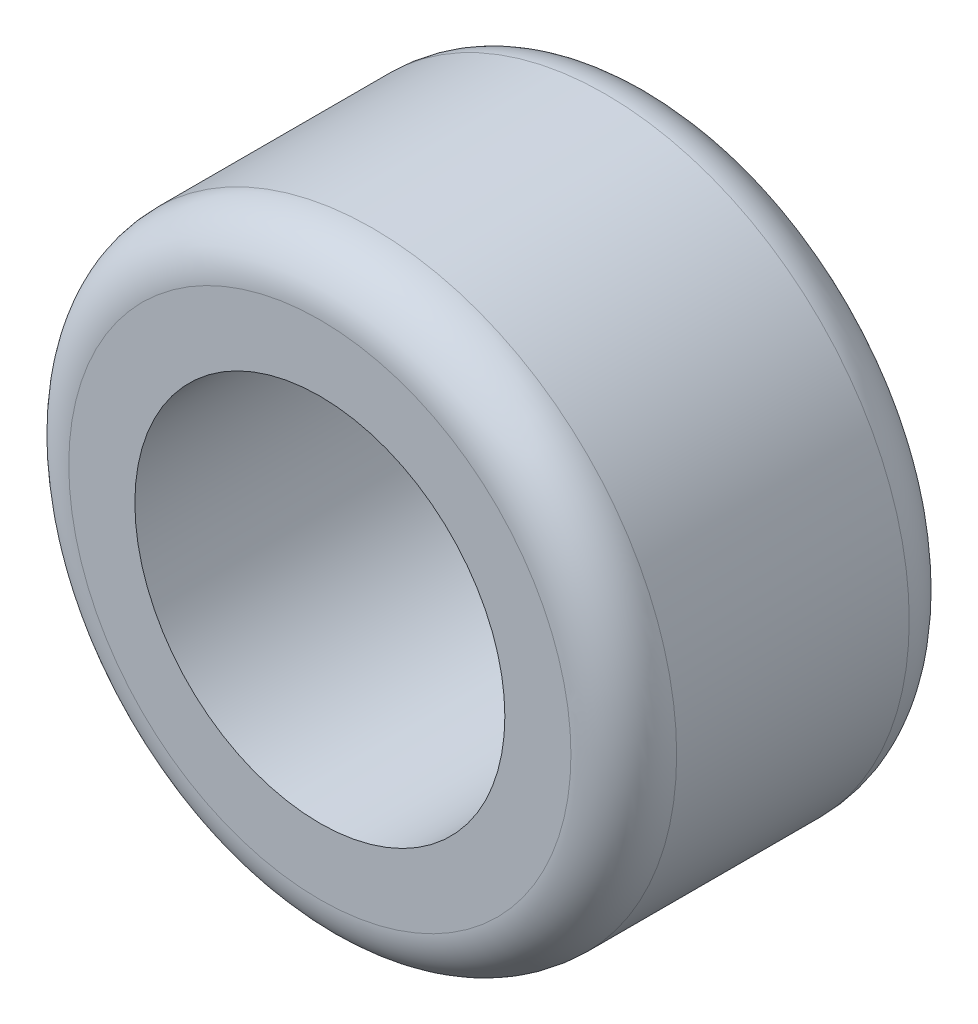
ISO-10303-21;
HEADER;
FILE_DESCRIPTION(('STEP AP214'),'2;1');
FILE_NAME('part.step','',(''),(''),'','','');
FILE_SCHEMA(('AUTOMOTIVE_DESIGN { 1 0 10303 214 1 1 1 1 }'));
ENDSEC;
DATA;
#1=APPLICATION_CONTEXT('core data for automotive mechanical design processes');
#2=APPLICATION_PROTOCOL_DEFINITION('international standard','automotive_design',2000,#1);
#3=PRODUCT_CONTEXT('',#1,'mechanical');
#4=PRODUCT('Part','Part','',(#3));
#5=PRODUCT_RELATED_PRODUCT_CATEGORY('part','',(#4));
#6=PRODUCT_DEFINITION_FORMATION('','',#4);
#7=PRODUCT_DEFINITION_CONTEXT('part definition',#1,'design');
#8=PRODUCT_DEFINITION('design','',#6,#7);
#9=PRODUCT_DEFINITION_SHAPE('','',#8);
#10=(LENGTH_UNIT() NAMED_UNIT(*) SI_UNIT(.MILLI.,.METRE.));
#11=(NAMED_UNIT(*) PLANE_ANGLE_UNIT() SI_UNIT($,.RADIAN.));
#12=(NAMED_UNIT(*) SI_UNIT($,.STERADIAN.) SOLID_ANGLE_UNIT());
#13=UNCERTAINTY_MEASURE_WITH_UNIT(LENGTH_MEASURE(1.E-05),#10,'distance_accuracy_value','');
#14=(GEOMETRIC_REPRESENTATION_CONTEXT(3) GLOBAL_UNCERTAINTY_ASSIGNED_CONTEXT((#13)) GLOBAL_UNIT_ASSIGNED_CONTEXT((#10,
#11,#12)) REPRESENTATION_CONTEXT('',''));
#15=CARTESIAN_POINT('',(0.,0.,0.));
#16=DIRECTION('',(0.,0.,1.));
#17=DIRECTION('',(1.,0.,0.));
#18=AXIS2_PLACEMENT_3D('',#15,#16,#17);
#19=CARTESIAN_POINT('',(0.,0.,40.64));
#20=DIRECTION('',(0.,0.,1.));
#21=DIRECTION('',(1.,0.,0.));
#22=AXIS2_PLACEMENT_3D('',#19,#20,#21);
#23=PLANE('',#22);
#24=CARTESIAN_POINT('',(0.,0.,40.64));
#25=DIRECTION('',(0.,0.,1.));
#26=DIRECTION('',(1.,0.,0.));
#27=AXIS2_PLACEMENT_3D('',#24,#25,#26);
#28=CIRCLE('',#27,60.325);
#29=CARTESIAN_POINT('',(60.325,0.,40.64));
#30=VERTEX_POINT('',#29);
#31=EDGE_CURVE('E10',#30,#30,#28,.T.);
#32=ORIENTED_EDGE('',*,*,#31,.T.);
#33=EDGE_LOOP('',(#32));
#34=FACE_BOUND('',#33,.T.);
#35=CARTESIAN_POINT('',(0.,0.,40.64));
#36=DIRECTION('',(0.,0.,1.));
#37=DIRECTION('',(1.,0.,0.));
#38=AXIS2_PLACEMENT_3D('',#35,#36,#37);
#39=CIRCLE('',#38,44.45);
#40=CARTESIAN_POINT('',(44.45,0.,40.64));
#41=VERTEX_POINT('',#40);
#42=EDGE_CURVE('E49',#41,#41,#39,.T.);
#43=ORIENTED_EDGE('',*,*,#42,.F.);
#44=EDGE_LOOP('',(#43));
#45=FACE_BOUND('',#44,.T.);
#46=ADVANCED_FACE('F29',(#34,#45),#23,.T.);
#47=CARTESIAN_POINT('',(0.,0.,-40.64));
#48=DIRECTION('',(0.,0.,1.));
#49=DIRECTION('',(1.,0.,0.));
#50=AXIS2_PLACEMENT_3D('',#47,#48,#49);
#51=PLANE('',#50);
#52=CARTESIAN_POINT('',(0.,0.,-40.64));
#53=DIRECTION('',(0.,0.,1.));
#54=DIRECTION('',(1.,0.,0.));
#55=AXIS2_PLACEMENT_3D('',#52,#53,#54);
#56=CIRCLE('',#55,60.325);
#57=CARTESIAN_POINT('',(60.325,0.,-40.64));
#58=VERTEX_POINT('',#57);
#59=EDGE_CURVE('E36',#58,#58,#56,.F.);
#60=ORIENTED_EDGE('',*,*,#59,.T.);
#61=EDGE_LOOP('',(#60));
#62=FACE_BOUND('',#61,.T.);
#63=CARTESIAN_POINT('',(0.,0.,-40.64));
#64=DIRECTION('',(0.,0.,1.));
#65=DIRECTION('',(1.,0.,0.));
#66=AXIS2_PLACEMENT_3D('',#63,#64,#65);
#67=CIRCLE('',#66,44.45);
#68=CARTESIAN_POINT('',(44.45,0.,-40.64));
#69=VERTEX_POINT('',#68);
#70=EDGE_CURVE('E50',#69,#69,#67,.T.);
#71=ORIENTED_EDGE('',*,*,#70,.T.);
#72=EDGE_LOOP('',(#71));
#73=FACE_BOUND('',#72,.T.);
#74=ADVANCED_FACE('F60',(#62,#73),#51,.F.);
#75=CARTESIAN_POINT('',(0.,0.,40.64));
#76=DIRECTION('',(0.,0.,-1.));
#77=DIRECTION('',(-1.,0.,0.));
#78=AXIS2_PLACEMENT_3D('',#75,#76,#77);
#79=CYLINDRICAL_SURFACE('',#78,73.025);
#80=CARTESIAN_POINT('',(0.,0.,-27.94));
#81=DIRECTION('',(0.,0.,1.));
#82=DIRECTION('',(1.,0.,0.));
#83=AXIS2_PLACEMENT_3D('',#80,#81,#82);
#84=CIRCLE('',#83,73.025);
#85=CARTESIAN_POINT('',(73.025,0.,-27.94));
#86=VERTEX_POINT('',#85);
#87=EDGE_CURVE('E40',#86,#86,#84,.T.);
#88=ORIENTED_EDGE('',*,*,#87,.T.);
#89=EDGE_LOOP('',(#88));
#90=FACE_BOUND('',#89,.T.);
#91=CARTESIAN_POINT('',(0.,0.,27.94));
#92=DIRECTION('',(0.,0.,1.));
#93=DIRECTION('',(1.,0.,0.));
#94=AXIS2_PLACEMENT_3D('',#91,#92,#93);
#95=CIRCLE('',#94,73.025);
#96=CARTESIAN_POINT('',(73.025,0.,27.94));
#97=VERTEX_POINT('',#96);
#98=EDGE_CURVE('E44',#97,#97,#95,.F.);
#99=ORIENTED_EDGE('',*,*,#98,.T.);
#100=EDGE_LOOP('',(#99));
#101=FACE_BOUND('',#100,.T.);
#102=ADVANCED_FACE('F66',(#90,#101),#79,.T.);
#103=CARTESIAN_POINT('',(0.,0.,40.64));
#104=DIRECTION('',(0.,0.,-1.));
#105=DIRECTION('',(-1.,0.,0.));
#106=AXIS2_PLACEMENT_3D('',#103,#104,#105);
#107=CYLINDRICAL_SURFACE('',#106,44.45);
#108=ORIENTED_EDGE('',*,*,#42,.T.);
#109=EDGE_LOOP('',(#108));
#110=FACE_BOUND('',#109,.T.);
#111=ORIENTED_EDGE('',*,*,#70,.F.);
#112=EDGE_LOOP('',(#111));
#113=FACE_BOUND('',#112,.T.);
#114=ADVANCED_FACE('F56',(#110,#113),#107,.F.);
#115=CARTESIAN_POINT('',(0.,0.,-27.94));
#116=DIRECTION('',(0.,0.,1.));
#117=DIRECTION('',(1.,0.,0.));
#118=AXIS2_PLACEMENT_3D('',#115,#116,#117);
#119=TOROIDAL_SURFACE('',#118,60.325,12.7);
#120=ORIENTED_EDGE('',*,*,#59,.F.);
#121=EDGE_LOOP('',(#120));
#122=FACE_BOUND('',#121,.T.);
#123=ORIENTED_EDGE('',*,*,#87,.F.);
#124=EDGE_LOOP('',(#123));
#125=FACE_BOUND('',#124,.T.);
#126=ADVANCED_FACE('F72',(#122,#125),#119,.T.);
#127=CARTESIAN_POINT('',(0.,0.,27.94));
#128=DIRECTION('',(0.,0.,1.));
#129=DIRECTION('',(1.,0.,0.));
#130=AXIS2_PLACEMENT_3D('',#127,#128,#129);
#131=TOROIDAL_SURFACE('',#130,60.325,12.7);
#132=ORIENTED_EDGE('',*,*,#98,.F.);
#133=EDGE_LOOP('',(#132));
#134=FACE_BOUND('',#133,.T.);
#135=ORIENTED_EDGE('',*,*,#31,.F.);
#136=EDGE_LOOP('',(#135));
#137=FACE_BOUND('',#136,.T.);
#138=ADVANCED_FACE('F31',(#134,#137),#131,.T.);
#139=CLOSED_SHELL('',(#46,#74,#102,#114,#126,#138));
#140=MANIFOLD_SOLID_BREP('B2',#139);
#141=ADVANCED_BREP_SHAPE_REPRESENTATION('',(#18,#140),#14);
#142=SHAPE_DEFINITION_REPRESENTATION(#9,#141);
ENDSEC;
END-ISO-10303-21;
